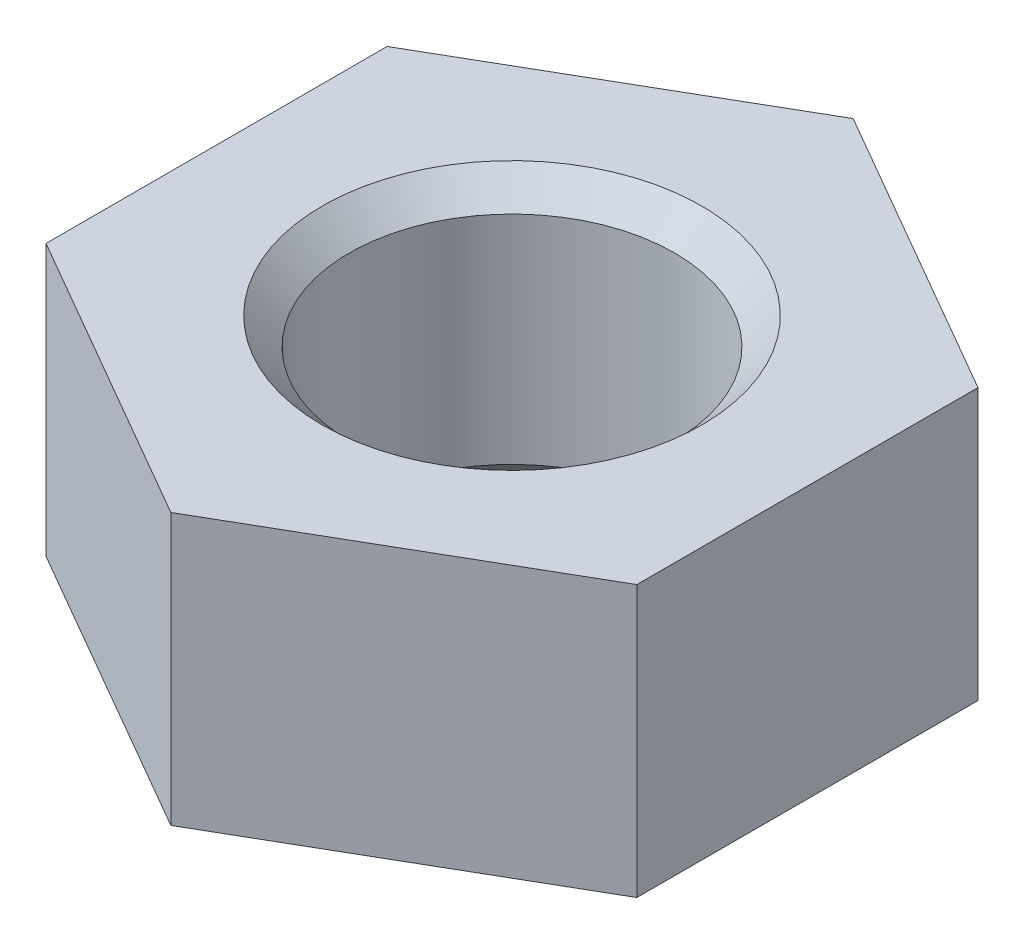
ISO-10303-21;
HEADER;
FILE_DESCRIPTION(('STEP AP214'),'2;1');
FILE_NAME('part.step','',(''),(''),'','','');
FILE_SCHEMA(('AUTOMOTIVE_DESIGN { 1 0 10303 214 1 1 1 1 }'));
ENDSEC;
DATA;
#1=APPLICATION_CONTEXT('core data for automotive mechanical design processes');
#2=APPLICATION_PROTOCOL_DEFINITION('international standard','automotive_design',2000,#1);
#3=PRODUCT_CONTEXT('',#1,'mechanical');
#4=PRODUCT('Part','Part','',(#3));
#5=PRODUCT_RELATED_PRODUCT_CATEGORY('part','',(#4));
#6=PRODUCT_DEFINITION_FORMATION('','',#4);
#7=PRODUCT_DEFINITION_CONTEXT('part definition',#1,'design');
#8=PRODUCT_DEFINITION('design','',#6,#7);
#9=PRODUCT_DEFINITION_SHAPE('','',#8);
#10=(LENGTH_UNIT() NAMED_UNIT(*) SI_UNIT(.MILLI.,.METRE.));
#11=(NAMED_UNIT(*) PLANE_ANGLE_UNIT() SI_UNIT($,.RADIAN.));
#12=(NAMED_UNIT(*) SI_UNIT($,.STERADIAN.) SOLID_ANGLE_UNIT());
#13=UNCERTAINTY_MEASURE_WITH_UNIT(LENGTH_MEASURE(1.E-05),#10,'distance_accuracy_value','');
#14=(GEOMETRIC_REPRESENTATION_CONTEXT(3) GLOBAL_UNCERTAINTY_ASSIGNED_CONTEXT((#13)) GLOBAL_UNIT_ASSIGNED_CONTEXT((#10,
#11,#12)) REPRESENTATION_CONTEXT('',''));
#15=CARTESIAN_POINT('',(0.,0.,0.));
#16=DIRECTION('',(0.,0.,1.));
#17=DIRECTION('',(1.,0.,0.));
#18=AXIS2_PLACEMENT_3D('',#15,#16,#17);
#19=CARTESIAN_POINT('',(0.,1.25,0.));
#20=DIRECTION('',(0.,1.,0.));
#21=DIRECTION('',(0.,0.,1.));
#22=AXIS2_PLACEMENT_3D('',#19,#20,#21);
#23=PLANE('',#22);
#24=CARTESIAN_POINT('',(0.,1.25,0.));
#25=DIRECTION('',(0.,1.,0.));
#26=DIRECTION('',(0.,0.,1.));
#27=AXIS2_PLACEMENT_3D('',#24,#25,#26);
#28=CIRCLE('',#27,1.75);
#29=CARTESIAN_POINT('',(0.,1.25,1.75));
#30=VERTEX_POINT('',#29);
#31=EDGE_CURVE('E11',#30,#30,#28,.F.);
#32=ORIENTED_EDGE('',*,*,#31,.T.);
#33=EDGE_LOOP('',(#32));
#34=FACE_BOUND('',#33,.T.);
#35=DIRECTION('',(-0.866025403784438,0.,0.5));
#36=VECTOR('',#35,1.);
#37=CARTESIAN_POINT('',(0.,1.25,-3.14655896708346));
#38=LINE('',#37,#36);
#39=CARTESIAN_POINT('',(0.,1.25,-3.14655896708346));
#40=VERTEX_POINT('',#39);
#41=CARTESIAN_POINT('',(-2.725,1.25,-1.57327948354173));
#42=VERTEX_POINT('',#41);
#43=EDGE_CURVE('E131',#40,#42,#38,.T.);
#44=ORIENTED_EDGE('',*,*,#43,.T.);
#45=DIRECTION('',(0.,0.,1.));
#46=VECTOR('',#45,1.);
#47=CARTESIAN_POINT('',(-2.725,1.25,-1.57327948354173));
#48=LINE('',#47,#46);
#49=CARTESIAN_POINT('',(-2.725,1.25,1.57327948354173));
#50=VERTEX_POINT('',#49);
#51=EDGE_CURVE('E91',#42,#50,#48,.T.);
#52=ORIENTED_EDGE('',*,*,#51,.T.);
#53=DIRECTION('',(0.866025403784439,0.,0.5));
#54=VECTOR('',#53,1.);
#55=CARTESIAN_POINT('',(-2.725,1.25,1.57327948354173));
#56=LINE('',#55,#54);
#57=CARTESIAN_POINT('',(0.,1.25,3.14655896708346));
#58=VERTEX_POINT('',#57);
#59=EDGE_CURVE('E103',#50,#58,#56,.T.);
#60=ORIENTED_EDGE('',*,*,#59,.T.);
#61=DIRECTION('',(0.866025403784438,0.,-0.5));
#62=VECTOR('',#61,1.);
#63=CARTESIAN_POINT('',(0.,1.25,3.14655896708346));
#64=LINE('',#63,#62);
#65=CARTESIAN_POINT('',(2.725,1.25,1.57327948354173));
#66=VERTEX_POINT('',#65);
#67=EDGE_CURVE('E98',#58,#66,#64,.T.);
#68=ORIENTED_EDGE('',*,*,#67,.T.);
#69=DIRECTION('',(0.,0.,-1.));
#70=VECTOR('',#69,1.);
#71=CARTESIAN_POINT('',(2.725,1.25,1.57327948354173));
#72=LINE('',#71,#70);
#73=CARTESIAN_POINT('',(2.725,1.25,-1.57327948354173));
#74=VERTEX_POINT('',#73);
#75=EDGE_CURVE('E101',#66,#74,#72,.T.);
#76=ORIENTED_EDGE('',*,*,#75,.T.);
#77=DIRECTION('',(-0.866025403784439,0.,-0.5));
#78=VECTOR('',#77,1.);
#79=CARTESIAN_POINT('',(2.725,1.25,-1.57327948354173));
#80=LINE('',#79,#78);
#81=EDGE_CURVE('E53',#74,#40,#80,.T.);
#82=ORIENTED_EDGE('',*,*,#81,.T.);
#83=EDGE_LOOP('',(#44,#52,#60,#68,#76,#82));
#84=FACE_BOUND('',#83,.T.);
#85=ADVANCED_FACE('F35',(#34,#84),#23,.T.);
#86=CARTESIAN_POINT('',(0.,-1.25,0.));
#87=DIRECTION('',(0.,1.,0.));
#88=DIRECTION('',(0.,0.,1.));
#89=AXIS2_PLACEMENT_3D('',#86,#87,#88);
#90=PLANE('',#89);
#91=CARTESIAN_POINT('',(0.,-1.25,0.));
#92=DIRECTION('',(0.,1.,0.));
#93=DIRECTION('',(0.,0.,1.));
#94=AXIS2_PLACEMENT_3D('',#91,#92,#93);
#95=CIRCLE('',#94,1.75);
#96=CARTESIAN_POINT('',(0.,-1.25,1.75));
#97=VERTEX_POINT('',#96);
#98=EDGE_CURVE('E140',#97,#97,#95,.T.);
#99=ORIENTED_EDGE('',*,*,#98,.T.);
#100=EDGE_LOOP('',(#99));
#101=FACE_BOUND('',#100,.T.);
#102=DIRECTION('',(-0.866025403784438,0.,0.5));
#103=VECTOR('',#102,1.);
#104=CARTESIAN_POINT('',(0.,-1.25,-3.14655896708346));
#105=LINE('',#104,#103);
#106=CARTESIAN_POINT('',(0.,-1.25,-3.14655896708346));
#107=VERTEX_POINT('',#106);
#108=CARTESIAN_POINT('',(-2.725,-1.25,-1.57327948354173));
#109=VERTEX_POINT('',#108);
#110=EDGE_CURVE('E121',#107,#109,#105,.T.);
#111=ORIENTED_EDGE('',*,*,#110,.F.);
#112=DIRECTION('',(-0.866025403784439,0.,-0.5));
#113=VECTOR('',#112,1.);
#114=CARTESIAN_POINT('',(2.725,-1.25,-1.57327948354173));
#115=LINE('',#114,#113);
#116=CARTESIAN_POINT('',(2.725,-1.25,-1.57327948354173));
#117=VERTEX_POINT('',#116);
#118=EDGE_CURVE('E82',#117,#107,#115,.T.);
#119=ORIENTED_EDGE('',*,*,#118,.F.);
#120=DIRECTION('',(0.,0.,-1.));
#121=VECTOR('',#120,1.);
#122=CARTESIAN_POINT('',(2.725,-1.25,1.57327948354173));
#123=LINE('',#122,#121);
#124=CARTESIAN_POINT('',(2.725,-1.25,1.57327948354173));
#125=VERTEX_POINT('',#124);
#126=EDGE_CURVE('E76',#125,#117,#123,.T.);
#127=ORIENTED_EDGE('',*,*,#126,.F.);
#128=DIRECTION('',(0.866025403784438,0.,-0.5));
#129=VECTOR('',#128,1.);
#130=CARTESIAN_POINT('',(0.,-1.25,3.14655896708346));
#131=LINE('',#130,#129);
#132=CARTESIAN_POINT('',(0.,-1.25,3.14655896708346));
#133=VERTEX_POINT('',#132);
#134=EDGE_CURVE('E111',#133,#125,#131,.T.);
#135=ORIENTED_EDGE('',*,*,#134,.F.);
#136=DIRECTION('',(0.866025403784439,0.,0.5));
#137=VECTOR('',#136,1.);
#138=CARTESIAN_POINT('',(-2.725,-1.25,1.57327948354173));
#139=LINE('',#138,#137);
#140=CARTESIAN_POINT('',(-2.725,-1.25,1.57327948354173));
#141=VERTEX_POINT('',#140);
#142=EDGE_CURVE('E126',#141,#133,#139,.T.);
#143=ORIENTED_EDGE('',*,*,#142,.F.);
#144=DIRECTION('',(0.,0.,1.));
#145=VECTOR('',#144,1.);
#146=CARTESIAN_POINT('',(-2.725,-1.25,-1.57327948354173));
#147=LINE('',#146,#145);
#148=EDGE_CURVE('E124',#109,#141,#147,.T.);
#149=ORIENTED_EDGE('',*,*,#148,.F.);
#150=EDGE_LOOP('',(#111,#119,#127,#135,#143,#149));
#151=FACE_BOUND('',#150,.T.);
#152=ADVANCED_FACE('F156',(#101,#151),#90,.F.);
#153=CARTESIAN_POINT('',(0.,1.25,-3.14655896708346));
#154=DIRECTION('',(0.5,0.,0.866025403784438));
#155=DIRECTION('',(0.866025403784439,0.,-0.5));
#156=AXIS2_PLACEMENT_3D('',#153,#154,#155);
#157=PLANE('',#156);
#158=ORIENTED_EDGE('',*,*,#110,.T.);
#159=DIRECTION('',(0.,-1.,0.));
#160=VECTOR('',#159,1.);
#161=CARTESIAN_POINT('',(-2.725,1.25,-1.57327948354173));
#162=LINE('',#161,#160);
#163=EDGE_CURVE('E138',#42,#109,#162,.T.);
#164=ORIENTED_EDGE('',*,*,#163,.F.);
#165=ORIENTED_EDGE('',*,*,#43,.F.);
#166=DIRECTION('',(0.,-1.,0.));
#167=VECTOR('',#166,1.);
#168=CARTESIAN_POINT('',(0.,1.25,-3.14655896708346));
#169=LINE('',#168,#167);
#170=EDGE_CURVE('E117',#40,#107,#169,.T.);
#171=ORIENTED_EDGE('',*,*,#170,.T.);
#172=EDGE_LOOP('',(#158,#164,#165,#171));
#173=FACE_BOUND('',#172,.T.);
#174=ADVANCED_FACE('F159',(#173),#157,.F.);
#175=CARTESIAN_POINT('',(-2.725,1.25,-1.57327948354173));
#176=DIRECTION('',(1.,0.,0.));
#177=DIRECTION('',(0.,0.,-1.));
#178=AXIS2_PLACEMENT_3D('',#175,#176,#177);
#179=PLANE('',#178);
#180=ORIENTED_EDGE('',*,*,#148,.T.);
#181=DIRECTION('',(0.,-1.,0.));
#182=VECTOR('',#181,1.);
#183=CARTESIAN_POINT('',(-2.725,1.25,1.57327948354173));
#184=LINE('',#183,#182);
#185=EDGE_CURVE('E135',#50,#141,#184,.T.);
#186=ORIENTED_EDGE('',*,*,#185,.F.);
#187=ORIENTED_EDGE('',*,*,#51,.F.);
#188=ORIENTED_EDGE('',*,*,#163,.T.);
#189=EDGE_LOOP('',(#180,#186,#187,#188));
#190=FACE_BOUND('',#189,.T.);
#191=ADVANCED_FACE('F235',(#190),#179,.F.);
#192=CARTESIAN_POINT('',(-2.725,1.25,1.57327948354173));
#193=DIRECTION('',(0.5,0.,-0.866025403784438));
#194=DIRECTION('',(-0.866025403784438,0.,-0.5));
#195=AXIS2_PLACEMENT_3D('',#192,#193,#194);
#196=PLANE('',#195);
#197=ORIENTED_EDGE('',*,*,#142,.T.);
#198=DIRECTION('',(0.,-1.,0.));
#199=VECTOR('',#198,1.);
#200=CARTESIAN_POINT('',(0.,1.25,3.14655896708346));
#201=LINE('',#200,#199);
#202=EDGE_CURVE('E112',#58,#133,#201,.T.);
#203=ORIENTED_EDGE('',*,*,#202,.F.);
#204=ORIENTED_EDGE('',*,*,#59,.F.);
#205=ORIENTED_EDGE('',*,*,#185,.T.);
#206=EDGE_LOOP('',(#197,#203,#204,#205));
#207=FACE_BOUND('',#206,.T.);
#208=ADVANCED_FACE('F226',(#207),#196,.F.);
#209=CARTESIAN_POINT('',(0.,1.25,3.14655896708346));
#210=DIRECTION('',(-0.5,0.,-0.866025403784439));
#211=DIRECTION('',(-0.866025403784439,0.,0.5));
#212=AXIS2_PLACEMENT_3D('',#209,#210,#211);
#213=PLANE('',#212);
#214=ORIENTED_EDGE('',*,*,#134,.T.);
#215=DIRECTION('',(0.,-1.,0.));
#216=VECTOR('',#215,1.);
#217=CARTESIAN_POINT('',(2.725,1.25,1.57327948354173));
#218=LINE('',#217,#216);
#219=EDGE_CURVE('E108',#66,#125,#218,.T.);
#220=ORIENTED_EDGE('',*,*,#219,.F.);
#221=ORIENTED_EDGE('',*,*,#67,.F.);
#222=ORIENTED_EDGE('',*,*,#202,.T.);
#223=EDGE_LOOP('',(#214,#220,#221,#222));
#224=FACE_BOUND('',#223,.T.);
#225=ADVANCED_FACE('F109',(#224),#213,.F.);
#226=CARTESIAN_POINT('',(2.725,1.25,1.57327948354173));
#227=DIRECTION('',(-1.,0.,0.));
#228=DIRECTION('',(0.,0.,1.));
#229=AXIS2_PLACEMENT_3D('',#226,#227,#228);
#230=PLANE('',#229);
#231=ORIENTED_EDGE('',*,*,#126,.T.);
#232=DIRECTION('',(0.,-1.,0.));
#233=VECTOR('',#232,1.);
#234=CARTESIAN_POINT('',(2.725,1.25,-1.57327948354173));
#235=LINE('',#234,#233);
#236=EDGE_CURVE('E113',#74,#117,#235,.T.);
#237=ORIENTED_EDGE('',*,*,#236,.F.);
#238=ORIENTED_EDGE('',*,*,#75,.F.);
#239=ORIENTED_EDGE('',*,*,#219,.T.);
#240=EDGE_LOOP('',(#231,#237,#238,#239));
#241=FACE_BOUND('',#240,.T.);
#242=ADVANCED_FACE('F115',(#241),#230,.F.);
#243=CARTESIAN_POINT('',(2.725,1.25,-1.57327948354173));
#244=DIRECTION('',(-0.5,0.,0.866025403784439));
#245=DIRECTION('',(0.866025403784439,0.,0.5));
#246=AXIS2_PLACEMENT_3D('',#243,#244,#245);
#247=PLANE('',#246);
#248=ORIENTED_EDGE('',*,*,#118,.T.);
#249=ORIENTED_EDGE('',*,*,#170,.F.);
#250=ORIENTED_EDGE('',*,*,#81,.F.);
#251=ORIENTED_EDGE('',*,*,#236,.T.);
#252=EDGE_LOOP('',(#248,#249,#250,#251));
#253=FACE_BOUND('',#252,.T.);
#254=ADVANCED_FACE('F166',(#253),#247,.F.);
#255=CARTESIAN_POINT('',(0.,1.25,0.));
#256=DIRECTION('',(0.,-1.,0.));
#257=DIRECTION('',(0.,0.,-1.));
#258=AXIS2_PLACEMENT_3D('',#255,#256,#257);
#259=CYLINDRICAL_SURFACE('',#258,1.5);
#260=CARTESIAN_POINT('',(0.,-0.999999999999999,0.));
#261=DIRECTION('',(0.,1.,0.));
#262=DIRECTION('',(0.,0.,1.));
#263=AXIS2_PLACEMENT_3D('',#260,#261,#262);
#264=CIRCLE('',#263,1.5);
#265=CARTESIAN_POINT('',(0.,-0.999999999999999,1.5));
#266=VERTEX_POINT('',#265);
#267=EDGE_CURVE('E45',#266,#266,#264,.F.);
#268=ORIENTED_EDGE('',*,*,#267,.T.);
#269=EDGE_LOOP('',(#268));
#270=FACE_BOUND('',#269,.T.);
#271=CARTESIAN_POINT('',(0.,0.999999999999999,0.));
#272=DIRECTION('',(0.,1.,0.));
#273=DIRECTION('',(0.,0.,1.));
#274=AXIS2_PLACEMENT_3D('',#271,#272,#273);
#275=CIRCLE('',#274,1.5);
#276=CARTESIAN_POINT('',(0.,0.999999999999999,1.5));
#277=VERTEX_POINT('',#276);
#278=EDGE_CURVE('E143',#277,#277,#275,.T.);
#279=ORIENTED_EDGE('',*,*,#278,.T.);
#280=EDGE_LOOP('',(#279));
#281=FACE_BOUND('',#280,.T.);
#282=ADVANCED_FACE('F148',(#270,#281),#259,.F.);
#283=CARTESIAN_POINT('',(0.,-1.25,0.));
#284=DIRECTION('',(0.,-1.,0.));
#285=DIRECTION('',(0.,0.,-1.));
#286=AXIS2_PLACEMENT_3D('',#283,#284,#285);
#287=CONICAL_SURFACE('',#286,1.75,0.785398163397449);
#288=ORIENTED_EDGE('',*,*,#267,.F.);
#289=EDGE_LOOP('',(#288));
#290=FACE_BOUND('',#289,.T.);
#291=ORIENTED_EDGE('',*,*,#98,.F.);
#292=EDGE_LOOP('',(#291));
#293=FACE_BOUND('',#292,.T.);
#294=ADVANCED_FACE('F151',(#290,#293),#287,.F.);
#295=CARTESIAN_POINT('',(0.,0.999999999999999,0.));
#296=DIRECTION('',(0.,1.,0.));
#297=DIRECTION('',(0.,0.,1.));
#298=AXIS2_PLACEMENT_3D('',#295,#296,#297);
#299=CONICAL_SURFACE('',#298,1.5,0.78539816339745);
#300=ORIENTED_EDGE('',*,*,#31,.F.);
#301=EDGE_LOOP('',(#300));
#302=FACE_BOUND('',#301,.T.);
#303=ORIENTED_EDGE('',*,*,#278,.F.);
#304=EDGE_LOOP('',(#303));
#305=FACE_BOUND('',#304,.T.);
#306=ADVANCED_FACE('F38',(#302,#305),#299,.F.);
#307=CLOSED_SHELL('',(#85,#152,#174,#191,#208,#225,#242,#254,#282,#294,#306));
#308=MANIFOLD_SOLID_BREP('B2',#307);
#309=ADVANCED_BREP_SHAPE_REPRESENTATION('',(#18,#308),#14);
#310=SHAPE_DEFINITION_REPRESENTATION(#9,#309);
ENDSEC;
END-ISO-10303-21;
